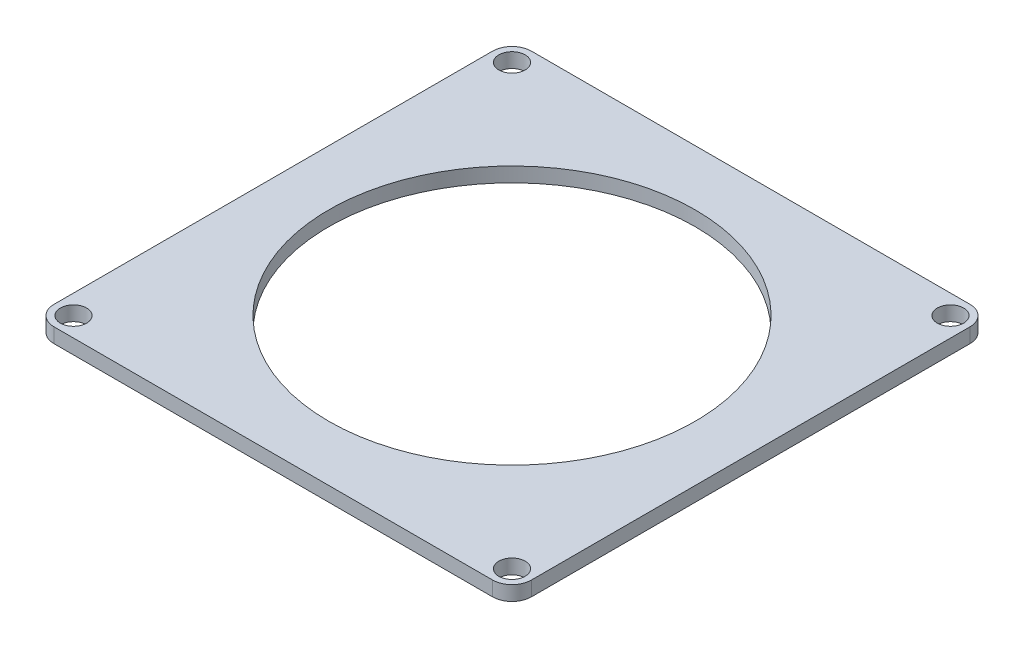
ISO-10303-21;
HEADER;
FILE_DESCRIPTION(('STEP AP214'),'2;1');
FILE_NAME('part.step','',(''),(''),'','','');
FILE_SCHEMA(('AUTOMOTIVE_DESIGN { 1 0 10303 214 1 1 1 1 }'));
ENDSEC;
DATA;
#1=APPLICATION_CONTEXT('core data for automotive mechanical design processes');
#2=APPLICATION_PROTOCOL_DEFINITION('international standard','automotive_design',2000,#1);
#3=PRODUCT_CONTEXT('',#1,'mechanical');
#4=PRODUCT('Part','Part','',(#3));
#5=PRODUCT_RELATED_PRODUCT_CATEGORY('part','',(#4));
#6=PRODUCT_DEFINITION_FORMATION('','',#4);
#7=PRODUCT_DEFINITION_CONTEXT('part definition',#1,'design');
#8=PRODUCT_DEFINITION('design','',#6,#7);
#9=PRODUCT_DEFINITION_SHAPE('','',#8);
#10=(LENGTH_UNIT() NAMED_UNIT(*) SI_UNIT(.MILLI.,.METRE.));
#11=(NAMED_UNIT(*) PLANE_ANGLE_UNIT() SI_UNIT($,.RADIAN.));
#12=(NAMED_UNIT(*) SI_UNIT($,.STERADIAN.) SOLID_ANGLE_UNIT());
#13=UNCERTAINTY_MEASURE_WITH_UNIT(LENGTH_MEASURE(1.E-05),#10,'distance_accuracy_value','');
#14=(GEOMETRIC_REPRESENTATION_CONTEXT(3) GLOBAL_UNCERTAINTY_ASSIGNED_CONTEXT((#13)) GLOBAL_UNIT_ASSIGNED_CONTEXT((#10,
#11,#12)) REPRESENTATION_CONTEXT('',''));
#15=CARTESIAN_POINT('',(0.,0.,0.));
#16=DIRECTION('',(0.,0.,1.));
#17=DIRECTION('',(1.,0.,0.));
#18=AXIS2_PLACEMENT_3D('',#15,#16,#17);
#19=CARTESIAN_POINT('',(0.,3.,49.));
#20=DIRECTION('',(0.,0.,-1.));
#21=DIRECTION('',(-1.,0.,0.));
#22=AXIS2_PLACEMENT_3D('',#19,#20,#21);
#23=PLANE('',#22);
#24=DIRECTION('',(1.,0.,0.));
#25=VECTOR('',#24,1.);
#26=CARTESIAN_POINT('',(0.,0.,49.));
#27=LINE('',#26,#25);
#28=CARTESIAN_POINT('',(-45.,0.,49.));
#29=VERTEX_POINT('',#28);
#30=CARTESIAN_POINT('',(45.,0.,49.));
#31=VERTEX_POINT('',#30);
#32=EDGE_CURVE('E139',#29,#31,#27,.T.);
#33=ORIENTED_EDGE('',*,*,#32,.T.);
#34=DIRECTION('',(0.,-1.,0.));
#35=VECTOR('',#34,1.);
#36=CARTESIAN_POINT('',(45.,3.,49.));
#37=LINE('',#36,#35);
#38=CARTESIAN_POINT('',(45.,3.,49.));
#39=VERTEX_POINT('',#38);
#40=EDGE_CURVE('E11',#39,#31,#37,.T.);
#41=ORIENTED_EDGE('',*,*,#40,.F.);
#42=DIRECTION('',(1.,0.,0.));
#43=VECTOR('',#42,1.);
#44=CARTESIAN_POINT('',(0.,3.,49.));
#45=LINE('',#44,#43);
#46=CARTESIAN_POINT('',(-45.,3.,49.));
#47=VERTEX_POINT('',#46);
#48=EDGE_CURVE('E157',#47,#39,#45,.T.);
#49=ORIENTED_EDGE('',*,*,#48,.F.);
#50=DIRECTION('',(0.,-1.,0.));
#51=VECTOR('',#50,1.);
#52=CARTESIAN_POINT('',(-45.,3.,49.));
#53=LINE('',#52,#51);
#54=EDGE_CURVE('E135',#47,#29,#53,.T.);
#55=ORIENTED_EDGE('',*,*,#54,.T.);
#56=EDGE_LOOP('',(#33,#41,#49,#55));
#57=FACE_BOUND('',#56,.T.);
#58=ADVANCED_FACE('F45',(#57),#23,.F.);
#59=CARTESIAN_POINT('',(45.,3.,45.));
#60=DIRECTION('',(0.,-1.,0.));
#61=DIRECTION('',(0.,0.,-1.));
#62=AXIS2_PLACEMENT_3D('',#59,#60,#61);
#63=CYLINDRICAL_SURFACE('',#62,4.00000000000001);
#64=CARTESIAN_POINT('',(45.,0.,45.));
#65=DIRECTION('',(0.,1.,0.));
#66=DIRECTION('',(0.,0.,1.));
#67=AXIS2_PLACEMENT_3D('',#64,#65,#66);
#68=CIRCLE('',#67,4.00000000000001);
#69=CARTESIAN_POINT('',(49.,0.,45.));
#70=VERTEX_POINT('',#69);
#71=EDGE_CURVE('E142',#31,#70,#68,.T.);
#72=ORIENTED_EDGE('',*,*,#71,.T.);
#73=DIRECTION('',(0.,-1.,0.));
#74=VECTOR('',#73,1.);
#75=CARTESIAN_POINT('',(49.,3.,45.));
#76=LINE('',#75,#74);
#77=CARTESIAN_POINT('',(49.,3.,45.));
#78=VERTEX_POINT('',#77);
#79=EDGE_CURVE('E53',#78,#70,#76,.T.);
#80=ORIENTED_EDGE('',*,*,#79,.F.);
#81=CARTESIAN_POINT('',(45.,3.,45.));
#82=DIRECTION('',(0.,1.,0.));
#83=DIRECTION('',(0.,0.,1.));
#84=AXIS2_PLACEMENT_3D('',#81,#82,#83);
#85=CIRCLE('',#84,4.00000000000001);
#86=EDGE_CURVE('E100',#39,#78,#85,.T.);
#87=ORIENTED_EDGE('',*,*,#86,.F.);
#88=ORIENTED_EDGE('',*,*,#40,.T.);
#89=EDGE_LOOP('',(#72,#80,#87,#88));
#90=FACE_BOUND('',#89,.T.);
#91=ADVANCED_FACE('F232',(#90),#63,.T.);
#92=CARTESIAN_POINT('',(49.,3.,0.));
#93=DIRECTION('',(-1.,0.,0.));
#94=DIRECTION('',(0.,0.,1.));
#95=AXIS2_PLACEMENT_3D('',#92,#93,#94);
#96=PLANE('',#95);
#97=DIRECTION('',(0.,0.,-1.));
#98=VECTOR('',#97,1.);
#99=CARTESIAN_POINT('',(49.,0.,0.));
#100=LINE('',#99,#98);
#101=CARTESIAN_POINT('',(49.,0.,-45.));
#102=VERTEX_POINT('',#101);
#103=EDGE_CURVE('E145',#70,#102,#100,.T.);
#104=ORIENTED_EDGE('',*,*,#103,.T.);
#105=DIRECTION('',(0.,-1.,0.));
#106=VECTOR('',#105,1.);
#107=CARTESIAN_POINT('',(49.,3.,-45.));
#108=LINE('',#107,#106);
#109=CARTESIAN_POINT('',(49.,3.,-45.));
#110=VERTEX_POINT('',#109);
#111=EDGE_CURVE('E163',#110,#102,#108,.T.);
#112=ORIENTED_EDGE('',*,*,#111,.F.);
#113=DIRECTION('',(0.,0.,-1.));
#114=VECTOR('',#113,1.);
#115=CARTESIAN_POINT('',(49.,3.,0.));
#116=LINE('',#115,#114);
#117=EDGE_CURVE('E171',#78,#110,#116,.T.);
#118=ORIENTED_EDGE('',*,*,#117,.F.);
#119=ORIENTED_EDGE('',*,*,#79,.T.);
#120=EDGE_LOOP('',(#104,#112,#118,#119));
#121=FACE_BOUND('',#120,.T.);
#122=ADVANCED_FACE('F169',(#121),#96,.F.);
#123=CARTESIAN_POINT('',(45.,3.,-45.));
#124=DIRECTION('',(0.,-1.,0.));
#125=DIRECTION('',(0.,0.,-1.));
#126=AXIS2_PLACEMENT_3D('',#123,#124,#125);
#127=CYLINDRICAL_SURFACE('',#126,4.00000000000001);
#128=CARTESIAN_POINT('',(45.,0.,-45.));
#129=DIRECTION('',(0.,1.,0.));
#130=DIRECTION('',(0.,0.,1.));
#131=AXIS2_PLACEMENT_3D('',#128,#129,#130);
#132=CIRCLE('',#131,4.00000000000001);
#133=CARTESIAN_POINT('',(45.,0.,-49.));
#134=VERTEX_POINT('',#133);
#135=EDGE_CURVE('E147',#102,#134,#132,.T.);
#136=ORIENTED_EDGE('',*,*,#135,.T.);
#137=DIRECTION('',(0.,-1.,0.));
#138=VECTOR('',#137,1.);
#139=CARTESIAN_POINT('',(45.,3.,-49.));
#140=LINE('',#139,#138);
#141=CARTESIAN_POINT('',(45.,3.,-49.));
#142=VERTEX_POINT('',#141);
#143=EDGE_CURVE('E161',#142,#134,#140,.T.);
#144=ORIENTED_EDGE('',*,*,#143,.F.);
#145=CARTESIAN_POINT('',(45.,3.,-45.));
#146=DIRECTION('',(0.,1.,0.));
#147=DIRECTION('',(0.,0.,1.));
#148=AXIS2_PLACEMENT_3D('',#145,#146,#147);
#149=CIRCLE('',#148,4.00000000000001);
#150=EDGE_CURVE('E181',#110,#142,#149,.T.);
#151=ORIENTED_EDGE('',*,*,#150,.F.);
#152=ORIENTED_EDGE('',*,*,#111,.T.);
#153=EDGE_LOOP('',(#136,#144,#151,#152));
#154=FACE_BOUND('',#153,.T.);
#155=ADVANCED_FACE('F179',(#154),#127,.T.);
#156=CARTESIAN_POINT('',(0.,3.,-49.));
#157=DIRECTION('',(0.,0.,-1.));
#158=DIRECTION('',(-1.,0.,0.));
#159=AXIS2_PLACEMENT_3D('',#156,#157,#158);
#160=PLANE('',#159);
#161=DIRECTION('',(1.,0.,0.));
#162=VECTOR('',#161,1.);
#163=CARTESIAN_POINT('',(0.,0.,-49.));
#164=LINE('',#163,#162);
#165=CARTESIAN_POINT('',(-45.,0.,-49.));
#166=VERTEX_POINT('',#165);
#167=EDGE_CURVE('E150',#166,#134,#164,.T.);
#168=ORIENTED_EDGE('',*,*,#167,.F.);
#169=DIRECTION('',(0.,-1.,0.));
#170=VECTOR('',#169,1.);
#171=CARTESIAN_POINT('',(-45.,3.,-49.));
#172=LINE('',#171,#170);
#173=CARTESIAN_POINT('',(-45.,3.,-49.));
#174=VERTEX_POINT('',#173);
#175=EDGE_CURVE('E131',#174,#166,#172,.T.);
#176=ORIENTED_EDGE('',*,*,#175,.F.);
#177=DIRECTION('',(1.,0.,0.));
#178=VECTOR('',#177,1.);
#179=CARTESIAN_POINT('',(0.,3.,-49.));
#180=LINE('',#179,#178);
#181=EDGE_CURVE('E120',#174,#142,#180,.T.);
#182=ORIENTED_EDGE('',*,*,#181,.T.);
#183=ORIENTED_EDGE('',*,*,#143,.T.);
#184=EDGE_LOOP('',(#168,#176,#182,#183));
#185=FACE_BOUND('',#184,.T.);
#186=ADVANCED_FACE('F240',(#185),#160,.T.);
#187=CARTESIAN_POINT('',(-45.,3.,-45.));
#188=DIRECTION('',(0.,-1.,0.));
#189=DIRECTION('',(0.,0.,-1.));
#190=AXIS2_PLACEMENT_3D('',#187,#188,#189);
#191=CYLINDRICAL_SURFACE('',#190,4.);
#192=CARTESIAN_POINT('',(-45.,0.,-45.));
#193=DIRECTION('',(0.,1.,0.));
#194=DIRECTION('',(0.,0.,1.));
#195=AXIS2_PLACEMENT_3D('',#192,#193,#194);
#196=CIRCLE('',#195,4.);
#197=CARTESIAN_POINT('',(-49.,0.,-45.));
#198=VERTEX_POINT('',#197);
#199=EDGE_CURVE('E127',#166,#198,#196,.T.);
#200=ORIENTED_EDGE('',*,*,#199,.T.);
#201=DIRECTION('',(0.,-1.,0.));
#202=VECTOR('',#201,1.);
#203=CARTESIAN_POINT('',(-49.,3.,-45.));
#204=LINE('',#203,#202);
#205=CARTESIAN_POINT('',(-49.,3.,-45.));
#206=VERTEX_POINT('',#205);
#207=EDGE_CURVE('E124',#206,#198,#204,.T.);
#208=ORIENTED_EDGE('',*,*,#207,.F.);
#209=CARTESIAN_POINT('',(-45.,3.,-45.));
#210=DIRECTION('',(0.,1.,0.));
#211=DIRECTION('',(0.,0.,1.));
#212=AXIS2_PLACEMENT_3D('',#209,#210,#211);
#213=CIRCLE('',#212,4.);
#214=EDGE_CURVE('E114',#174,#206,#213,.T.);
#215=ORIENTED_EDGE('',*,*,#214,.F.);
#216=ORIENTED_EDGE('',*,*,#175,.T.);
#217=EDGE_LOOP('',(#200,#208,#215,#216));
#218=FACE_BOUND('',#217,.T.);
#219=ADVANCED_FACE('F125',(#218),#191,.T.);
#220=CARTESIAN_POINT('',(-49.,3.,0.));
#221=DIRECTION('',(-1.,0.,0.));
#222=DIRECTION('',(0.,0.,1.));
#223=AXIS2_PLACEMENT_3D('',#220,#221,#222);
#224=PLANE('',#223);
#225=DIRECTION('',(0.,0.,-1.));
#226=VECTOR('',#225,1.);
#227=CARTESIAN_POINT('',(-49.,0.,0.));
#228=LINE('',#227,#226);
#229=CARTESIAN_POINT('',(-49.,0.,45.));
#230=VERTEX_POINT('',#229);
#231=EDGE_CURVE('E154',#230,#198,#228,.T.);
#232=ORIENTED_EDGE('',*,*,#231,.F.);
#233=DIRECTION('',(0.,-1.,0.));
#234=VECTOR('',#233,1.);
#235=CARTESIAN_POINT('',(-49.,3.,45.));
#236=LINE('',#235,#234);
#237=CARTESIAN_POINT('',(-49.,3.,45.));
#238=VERTEX_POINT('',#237);
#239=EDGE_CURVE('E89',#238,#230,#236,.T.);
#240=ORIENTED_EDGE('',*,*,#239,.F.);
#241=DIRECTION('',(0.,0.,-1.));
#242=VECTOR('',#241,1.);
#243=CARTESIAN_POINT('',(-49.,3.,0.));
#244=LINE('',#243,#242);
#245=EDGE_CURVE('E118',#238,#206,#244,.T.);
#246=ORIENTED_EDGE('',*,*,#245,.T.);
#247=ORIENTED_EDGE('',*,*,#207,.T.);
#248=EDGE_LOOP('',(#232,#240,#246,#247));
#249=FACE_BOUND('',#248,.T.);
#250=ADVANCED_FACE('F133',(#249),#224,.T.);
#251=CARTESIAN_POINT('',(-45.,3.,45.));
#252=DIRECTION('',(0.,-1.,0.));
#253=DIRECTION('',(0.,0.,-1.));
#254=AXIS2_PLACEMENT_3D('',#251,#252,#253);
#255=CYLINDRICAL_SURFACE('',#254,4.00000000000001);
#256=CARTESIAN_POINT('',(-45.,0.,45.));
#257=DIRECTION('',(0.,1.,0.));
#258=DIRECTION('',(0.,0.,1.));
#259=AXIS2_PLACEMENT_3D('',#256,#257,#258);
#260=CIRCLE('',#259,4.00000000000001);
#261=EDGE_CURVE('E92',#230,#29,#260,.T.);
#262=ORIENTED_EDGE('',*,*,#261,.T.);
#263=ORIENTED_EDGE('',*,*,#54,.F.);
#264=CARTESIAN_POINT('',(-45.,3.,45.));
#265=DIRECTION('',(0.,1.,0.));
#266=DIRECTION('',(0.,0.,1.));
#267=AXIS2_PLACEMENT_3D('',#264,#265,#266);
#268=CIRCLE('',#267,4.00000000000001);
#269=EDGE_CURVE('E61',#238,#47,#268,.T.);
#270=ORIENTED_EDGE('',*,*,#269,.F.);
#271=ORIENTED_EDGE('',*,*,#239,.T.);
#272=EDGE_LOOP('',(#262,#263,#270,#271));
#273=FACE_BOUND('',#272,.T.);
#274=ADVANCED_FACE('F281',(#273),#255,.T.);
#275=CARTESIAN_POINT('',(0.,3.,0.));
#276=DIRECTION('',(0.,1.,0.));
#277=DIRECTION('',(0.,0.,1.));
#278=AXIS2_PLACEMENT_3D('',#275,#276,#277);
#279=PLANE('',#278);
#280=CARTESIAN_POINT('',(-45.0000000000002,3.,44.9999999999998));
#281=DIRECTION('',(0.,1.,0.));
#282=DIRECTION('',(0.,0.,1.));
#283=AXIS2_PLACEMENT_3D('',#280,#281,#282);
#284=CIRCLE('',#283,2.7);
#285=CARTESIAN_POINT('',(-45.0000000000002,3.,47.6999999999998));
#286=VERTEX_POINT('',#285);
#287=EDGE_CURVE('E198',#286,#286,#284,.F.);
#288=ORIENTED_EDGE('',*,*,#287,.T.);
#289=EDGE_LOOP('',(#288));
#290=FACE_BOUND('',#289,.T.);
#291=CARTESIAN_POINT('',(-45.,3.,-45.));
#292=DIRECTION('',(0.,1.,0.));
#293=DIRECTION('',(0.,0.,1.));
#294=AXIS2_PLACEMENT_3D('',#291,#292,#293);
#295=CIRCLE('',#294,2.7);
#296=CARTESIAN_POINT('',(-45.,3.,-42.3));
#297=VERTEX_POINT('',#296);
#298=EDGE_CURVE('E201',#297,#297,#295,.F.);
#299=ORIENTED_EDGE('',*,*,#298,.T.);
#300=EDGE_LOOP('',(#299));
#301=FACE_BOUND('',#300,.T.);
#302=CARTESIAN_POINT('',(45.0000000000005,3.,-44.9999999999995));
#303=DIRECTION('',(0.,1.,0.));
#304=DIRECTION('',(0.,0.,1.));
#305=AXIS2_PLACEMENT_3D('',#302,#303,#304);
#306=CIRCLE('',#305,2.7);
#307=CARTESIAN_POINT('',(45.0000000000005,3.,-42.2999999999995));
#308=VERTEX_POINT('',#307);
#309=EDGE_CURVE('E204',#308,#308,#306,.F.);
#310=ORIENTED_EDGE('',*,*,#309,.T.);
#311=EDGE_LOOP('',(#310));
#312=FACE_BOUND('',#311,.T.);
#313=CARTESIAN_POINT('',(45.,3.,45.));
#314=DIRECTION('',(0.,1.,0.));
#315=DIRECTION('',(0.,0.,1.));
#316=AXIS2_PLACEMENT_3D('',#313,#314,#315);
#317=CIRCLE('',#316,2.7);
#318=CARTESIAN_POINT('',(45.,3.,47.7));
#319=VERTEX_POINT('',#318);
#320=EDGE_CURVE('E190',#319,#319,#317,.F.);
#321=ORIENTED_EDGE('',*,*,#320,.T.);
#322=EDGE_LOOP('',(#321));
#323=FACE_BOUND('',#322,.T.);
#324=CARTESIAN_POINT('',(0.,3.,0.));
#325=DIRECTION('',(0.,1.,0.));
#326=DIRECTION('',(0.,0.,1.));
#327=AXIS2_PLACEMENT_3D('',#324,#325,#326);
#328=CIRCLE('',#327,37.6);
#329=CARTESIAN_POINT('',(0.,3.,37.6));
#330=VERTEX_POINT('',#329);
#331=EDGE_CURVE('E187',#330,#330,#328,.T.);
#332=ORIENTED_EDGE('',*,*,#331,.F.);
#333=EDGE_LOOP('',(#332));
#334=FACE_BOUND('',#333,.T.);
#335=ORIENTED_EDGE('',*,*,#48,.T.);
#336=ORIENTED_EDGE('',*,*,#86,.T.);
#337=ORIENTED_EDGE('',*,*,#117,.T.);
#338=ORIENTED_EDGE('',*,*,#150,.T.);
#339=ORIENTED_EDGE('',*,*,#181,.F.);
#340=ORIENTED_EDGE('',*,*,#214,.T.);
#341=ORIENTED_EDGE('',*,*,#245,.F.);
#342=ORIENTED_EDGE('',*,*,#269,.T.);
#343=EDGE_LOOP('',(#335,#336,#337,#338,#339,#340,#341,#342));
#344=FACE_BOUND('',#343,.T.);
#345=ADVANCED_FACE('F116',(#290,#301,#312,#323,#334,#344),#279,.T.);
#346=CARTESIAN_POINT('',(0.,0.,0.));
#347=DIRECTION('',(0.,1.,0.));
#348=DIRECTION('',(0.,0.,1.));
#349=AXIS2_PLACEMENT_3D('',#346,#347,#348);
#350=PLANE('',#349);
#351=CARTESIAN_POINT('',(-45.0000000000002,0.,44.9999999999998));
#352=DIRECTION('',(0.,1.,0.));
#353=DIRECTION('',(-1.,0.,0.));
#354=AXIS2_PLACEMENT_3D('',#351,#352,#353);
#355=CIRCLE('',#354,2.7);
#356=CARTESIAN_POINT('',(-47.7000000000002,0.,44.9999999999998));
#357=VERTEX_POINT('',#356);
#358=EDGE_CURVE('E207',#357,#357,#355,.T.);
#359=ORIENTED_EDGE('',*,*,#358,.T.);
#360=EDGE_LOOP('',(#359));
#361=FACE_BOUND('',#360,.T.);
#362=CARTESIAN_POINT('',(-45.,0.,-45.));
#363=DIRECTION('',(0.,1.,0.));
#364=DIRECTION('',(0.,0.,-1.));
#365=AXIS2_PLACEMENT_3D('',#362,#363,#364);
#366=CIRCLE('',#365,2.7);
#367=CARTESIAN_POINT('',(-45.,0.,-47.7));
#368=VERTEX_POINT('',#367);
#369=EDGE_CURVE('E211',#368,#368,#366,.T.);
#370=ORIENTED_EDGE('',*,*,#369,.T.);
#371=EDGE_LOOP('',(#370));
#372=FACE_BOUND('',#371,.T.);
#373=CARTESIAN_POINT('',(45.0000000000005,0.,-44.9999999999995));
#374=DIRECTION('',(0.,1.,0.));
#375=DIRECTION('',(1.,0.,0.));
#376=AXIS2_PLACEMENT_3D('',#373,#374,#375);
#377=CIRCLE('',#376,2.7);
#378=CARTESIAN_POINT('',(47.7000000000005,0.,-44.9999999999995));
#379=VERTEX_POINT('',#378);
#380=EDGE_CURVE('E208',#379,#379,#377,.T.);
#381=ORIENTED_EDGE('',*,*,#380,.T.);
#382=EDGE_LOOP('',(#381));
#383=FACE_BOUND('',#382,.T.);
#384=CARTESIAN_POINT('',(45.,0.,45.));
#385=DIRECTION('',(0.,1.,0.));
#386=DIRECTION('',(0.,0.,1.));
#387=AXIS2_PLACEMENT_3D('',#384,#385,#386);
#388=CIRCLE('',#387,2.7);
#389=CARTESIAN_POINT('',(45.,0.,47.7));
#390=VERTEX_POINT('',#389);
#391=EDGE_CURVE('E195',#390,#390,#388,.T.);
#392=ORIENTED_EDGE('',*,*,#391,.T.);
#393=EDGE_LOOP('',(#392));
#394=FACE_BOUND('',#393,.T.);
#395=CARTESIAN_POINT('',(0.,0.,0.));
#396=DIRECTION('',(0.,1.,0.));
#397=DIRECTION('',(0.,0.,1.));
#398=AXIS2_PLACEMENT_3D('',#395,#396,#397);
#399=CIRCLE('',#398,37.6);
#400=CARTESIAN_POINT('',(0.,0.,37.6));
#401=VERTEX_POINT('',#400);
#402=EDGE_CURVE('E143',#401,#401,#399,.T.);
#403=ORIENTED_EDGE('',*,*,#402,.T.);
#404=EDGE_LOOP('',(#403));
#405=FACE_BOUND('',#404,.T.);
#406=ORIENTED_EDGE('',*,*,#32,.F.);
#407=ORIENTED_EDGE('',*,*,#261,.F.);
#408=ORIENTED_EDGE('',*,*,#231,.T.);
#409=ORIENTED_EDGE('',*,*,#199,.F.);
#410=ORIENTED_EDGE('',*,*,#167,.T.);
#411=ORIENTED_EDGE('',*,*,#135,.F.);
#412=ORIENTED_EDGE('',*,*,#103,.F.);
#413=ORIENTED_EDGE('',*,*,#71,.F.);
#414=EDGE_LOOP('',(#406,#407,#408,#409,#410,#411,#412,#413));
#415=FACE_BOUND('',#414,.T.);
#416=ADVANCED_FACE('F175',(#361,#372,#383,#394,#405,#415),#350,.F.);
#417=CARTESIAN_POINT('',(0.,0.,0.));
#418=DIRECTION('',(0.,1.,0.));
#419=DIRECTION('',(0.,0.,1.));
#420=AXIS2_PLACEMENT_3D('',#417,#418,#419);
#421=CYLINDRICAL_SURFACE('',#420,37.6);
#422=ORIENTED_EDGE('',*,*,#402,.F.);
#423=EDGE_LOOP('',(#422));
#424=FACE_BOUND('',#423,.T.);
#425=ORIENTED_EDGE('',*,*,#331,.T.);
#426=EDGE_LOOP('',(#425));
#427=FACE_BOUND('',#426,.T.);
#428=ADVANCED_FACE('F323',(#424,#427),#421,.F.);
#429=CARTESIAN_POINT('',(45.,10.,45.));
#430=DIRECTION('',(0.,-1.,0.));
#431=DIRECTION('',(0.,0.,-1.));
#432=AXIS2_PLACEMENT_3D('',#429,#430,#431);
#433=CYLINDRICAL_SURFACE('',#432,2.7);
#434=ORIENTED_EDGE('',*,*,#320,.F.);
#435=EDGE_LOOP('',(#434));
#436=FACE_BOUND('',#435,.T.);
#437=ORIENTED_EDGE('',*,*,#391,.F.);
#438=EDGE_LOOP('',(#437));
#439=FACE_BOUND('',#438,.T.);
#440=ADVANCED_FACE('F347',(#436,#439),#433,.F.);
#441=CARTESIAN_POINT('',(45.0000000000005,10.,-44.9999999999995));
#442=DIRECTION('',(0.,-1.,0.));
#443=DIRECTION('',(0.,0.,-1.));
#444=AXIS2_PLACEMENT_3D('',#441,#442,#443);
#445=CYLINDRICAL_SURFACE('',#444,2.7);
#446=ORIENTED_EDGE('',*,*,#309,.F.);
#447=EDGE_LOOP('',(#446));
#448=FACE_BOUND('',#447,.T.);
#449=ORIENTED_EDGE('',*,*,#380,.F.);
#450=EDGE_LOOP('',(#449));
#451=FACE_BOUND('',#450,.T.);
#452=ADVANCED_FACE('F227',(#448,#451),#445,.F.);
#453=CARTESIAN_POINT('',(-45.,10.,-45.));
#454=DIRECTION('',(0.,-1.,0.));
#455=DIRECTION('',(0.,0.,-1.));
#456=AXIS2_PLACEMENT_3D('',#453,#454,#455);
#457=CYLINDRICAL_SURFACE('',#456,2.7);
#458=ORIENTED_EDGE('',*,*,#298,.F.);
#459=EDGE_LOOP('',(#458));
#460=FACE_BOUND('',#459,.T.);
#461=ORIENTED_EDGE('',*,*,#369,.F.);
#462=EDGE_LOOP('',(#461));
#463=FACE_BOUND('',#462,.T.);
#464=ADVANCED_FACE('F221',(#460,#463),#457,.F.);
#465=CARTESIAN_POINT('',(-45.0000000000002,10.,44.9999999999998));
#466=DIRECTION('',(0.,-1.,0.));
#467=DIRECTION('',(0.,0.,-1.));
#468=AXIS2_PLACEMENT_3D('',#465,#466,#467);
#469=CYLINDRICAL_SURFACE('',#468,2.7);
#470=ORIENTED_EDGE('',*,*,#287,.F.);
#471=EDGE_LOOP('',(#470));
#472=FACE_BOUND('',#471,.T.);
#473=ORIENTED_EDGE('',*,*,#358,.F.);
#474=EDGE_LOOP('',(#473));
#475=FACE_BOUND('',#474,.T.);
#476=ADVANCED_FACE('F219',(#472,#475),#469,.F.);
#477=CLOSED_SHELL('',(#58,#91,#122,#155,#186,#219,#250,#274,#345,#416,#428,#440,#452,#464,#476));
#478=MANIFOLD_SOLID_BREP('B2',#477);
#479=ADVANCED_BREP_SHAPE_REPRESENTATION('',(#18,#478),#14);
#480=SHAPE_DEFINITION_REPRESENTATION(#9,#479);
ENDSEC;
END-ISO-10303-21;
